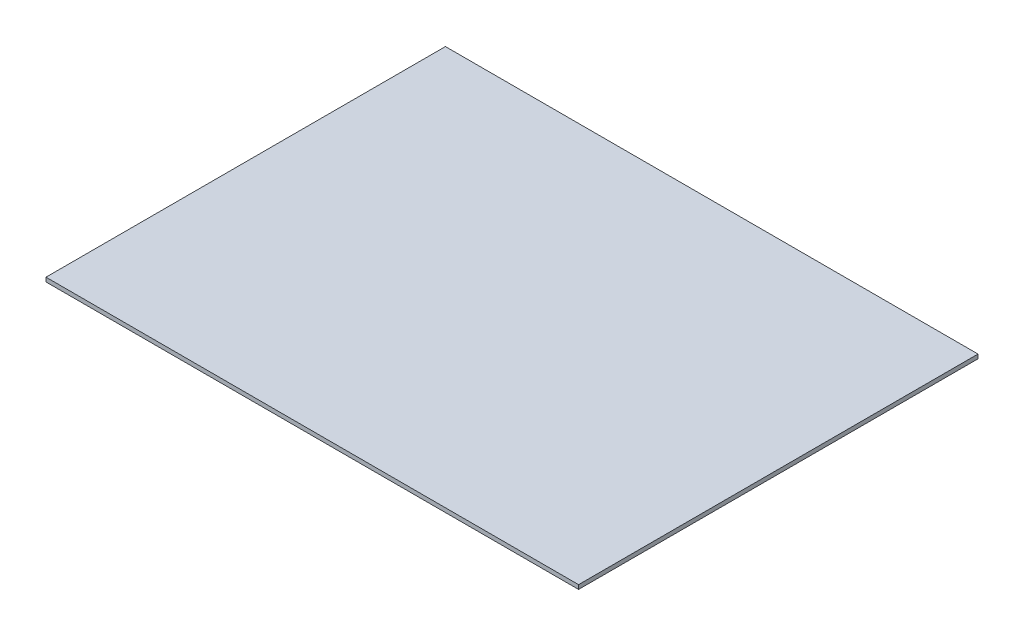
ISO-10303-21;
HEADER;
FILE_DESCRIPTION(('STEP AP214'),'2;1');
FILE_NAME('part.step','',(''),(''),'','','');
FILE_SCHEMA(('AUTOMOTIVE_DESIGN { 1 0 10303 214 1 1 1 1 }'));
ENDSEC;
DATA;
#1=APPLICATION_CONTEXT('core data for automotive mechanical design processes');
#2=APPLICATION_PROTOCOL_DEFINITION('international standard','automotive_design',2000,#1);
#3=PRODUCT_CONTEXT('',#1,'mechanical');
#4=PRODUCT('Part','Part','',(#3));
#5=PRODUCT_RELATED_PRODUCT_CATEGORY('part','',(#4));
#6=PRODUCT_DEFINITION_FORMATION('','',#4);
#7=PRODUCT_DEFINITION_CONTEXT('part definition',#1,'design');
#8=PRODUCT_DEFINITION('design','',#6,#7);
#9=PRODUCT_DEFINITION_SHAPE('','',#8);
#10=(LENGTH_UNIT() NAMED_UNIT(*) SI_UNIT(.MILLI.,.METRE.));
#11=(NAMED_UNIT(*) PLANE_ANGLE_UNIT() SI_UNIT($,.RADIAN.));
#12=(NAMED_UNIT(*) SI_UNIT($,.STERADIAN.) SOLID_ANGLE_UNIT());
#13=UNCERTAINTY_MEASURE_WITH_UNIT(LENGTH_MEASURE(1.E-05),#10,'distance_accuracy_value','');
#14=(GEOMETRIC_REPRESENTATION_CONTEXT(3) GLOBAL_UNCERTAINTY_ASSIGNED_CONTEXT((#13)) GLOBAL_UNIT_ASSIGNED_CONTEXT((#10,
#11,#12)) REPRESENTATION_CONTEXT('',''));
#15=CARTESIAN_POINT('',(0.,0.,0.));
#16=DIRECTION('',(0.,0.,1.));
#17=DIRECTION('',(1.,0.,0.));
#18=AXIS2_PLACEMENT_3D('',#15,#16,#17);
#19=CARTESIAN_POINT('',(203.2,3.175,0.));
#20=DIRECTION('',(-1.,0.,0.));
#21=DIRECTION('',(0.,0.,1.));
#22=AXIS2_PLACEMENT_3D('',#19,#20,#21);
#23=PLANE('',#22);
#24=DIRECTION('',(0.,0.,-1.));
#25=VECTOR('',#24,1.);
#26=CARTESIAN_POINT('',(203.2,0.,0.));
#27=LINE('',#26,#25);
#28=CARTESIAN_POINT('',(203.2,0.,0.));
#29=VERTEX_POINT('',#28);
#30=CARTESIAN_POINT('',(203.2,0.,-304.8));
#31=VERTEX_POINT('',#30);
#32=EDGE_CURVE('E96',#29,#31,#27,.T.);
#33=ORIENTED_EDGE('',*,*,#32,.T.);
#34=DIRECTION('',(0.,-1.,0.));
#35=VECTOR('',#34,1.);
#36=CARTESIAN_POINT('',(203.2,3.175,-304.8));
#37=LINE('',#36,#35);
#38=CARTESIAN_POINT('',(203.2,3.175,-304.8));
#39=VERTEX_POINT('',#38);
#40=EDGE_CURVE('E11',#39,#31,#37,.T.);
#41=ORIENTED_EDGE('',*,*,#40,.F.);
#42=DIRECTION('',(0.,0.,-1.));
#43=VECTOR('',#42,1.);
#44=CARTESIAN_POINT('',(203.2,3.175,0.));
#45=LINE('',#44,#43);
#46=CARTESIAN_POINT('',(203.2,3.175,0.));
#47=VERTEX_POINT('',#46);
#48=EDGE_CURVE('E84',#47,#39,#45,.T.);
#49=ORIENTED_EDGE('',*,*,#48,.F.);
#50=DIRECTION('',(0.,-1.,0.));
#51=VECTOR('',#50,1.);
#52=CARTESIAN_POINT('',(203.2,3.175,0.));
#53=LINE('',#52,#51);
#54=EDGE_CURVE('E92',#47,#29,#53,.T.);
#55=ORIENTED_EDGE('',*,*,#54,.T.);
#56=EDGE_LOOP('',(#33,#41,#49,#55));
#57=FACE_BOUND('',#56,.T.);
#58=ADVANCED_FACE('F33',(#57),#23,.F.);
#59=CARTESIAN_POINT('',(-203.2,3.175,-304.8));
#60=DIRECTION('',(0.,0.,1.));
#61=DIRECTION('',(1.,0.,0.));
#62=AXIS2_PLACEMENT_3D('',#59,#60,#61);
#63=PLANE('',#62);
#64=DIRECTION('',(-1.,0.,0.));
#65=VECTOR('',#64,1.);
#66=CARTESIAN_POINT('',(-203.2,0.,-304.8));
#67=LINE('',#66,#65);
#68=CARTESIAN_POINT('',(-203.2,0.,-304.8));
#69=VERTEX_POINT('',#68);
#70=EDGE_CURVE('E88',#31,#69,#67,.T.);
#71=ORIENTED_EDGE('',*,*,#70,.T.);
#72=DIRECTION('',(0.,-1.,0.));
#73=VECTOR('',#72,1.);
#74=CARTESIAN_POINT('',(-203.2,3.175,-304.8));
#75=LINE('',#74,#73);
#76=CARTESIAN_POINT('',(-203.2,3.175,-304.8));
#77=VERTEX_POINT('',#76);
#78=EDGE_CURVE('E41',#77,#69,#75,.T.);
#79=ORIENTED_EDGE('',*,*,#78,.F.);
#80=DIRECTION('',(-1.,0.,0.));
#81=VECTOR('',#80,1.);
#82=CARTESIAN_POINT('',(-203.2,3.175,-304.8));
#83=LINE('',#82,#81);
#84=EDGE_CURVE('E79',#39,#77,#83,.T.);
#85=ORIENTED_EDGE('',*,*,#84,.F.);
#86=ORIENTED_EDGE('',*,*,#40,.T.);
#87=EDGE_LOOP('',(#71,#79,#85,#86));
#88=FACE_BOUND('',#87,.T.);
#89=ADVANCED_FACE('F87',(#88),#63,.F.);
#90=CARTESIAN_POINT('',(-203.2,3.175,-304.8));
#91=DIRECTION('',(1.,0.,0.));
#92=DIRECTION('',(0.,0.,-1.));
#93=AXIS2_PLACEMENT_3D('',#90,#91,#92);
#94=PLANE('',#93);
#95=DIRECTION('',(0.,0.,1.));
#96=VECTOR('',#95,1.);
#97=CARTESIAN_POINT('',(-203.2,0.,-304.8));
#98=LINE('',#97,#96);
#99=CARTESIAN_POINT('',(-203.2,0.,0.));
#100=VERTEX_POINT('',#99);
#101=EDGE_CURVE('E66',#69,#100,#98,.T.);
#102=ORIENTED_EDGE('',*,*,#101,.T.);
#103=DIRECTION('',(0.,-1.,0.));
#104=VECTOR('',#103,1.);
#105=CARTESIAN_POINT('',(-203.2,3.175,0.));
#106=LINE('',#105,#104);
#107=CARTESIAN_POINT('',(-203.2,3.175,0.));
#108=VERTEX_POINT('',#107);
#109=EDGE_CURVE('E89',#108,#100,#106,.T.);
#110=ORIENTED_EDGE('',*,*,#109,.F.);
#111=DIRECTION('',(0.,0.,1.));
#112=VECTOR('',#111,1.);
#113=CARTESIAN_POINT('',(-203.2,3.175,-304.8));
#114=LINE('',#113,#112);
#115=EDGE_CURVE('E82',#77,#108,#114,.T.);
#116=ORIENTED_EDGE('',*,*,#115,.F.);
#117=ORIENTED_EDGE('',*,*,#78,.T.);
#118=EDGE_LOOP('',(#102,#110,#116,#117));
#119=FACE_BOUND('',#118,.T.);
#120=ADVANCED_FACE('F90',(#119),#94,.F.);
#121=CARTESIAN_POINT('',(-203.2,3.175,0.));
#122=DIRECTION('',(0.,0.,-1.));
#123=DIRECTION('',(-1.,0.,0.));
#124=AXIS2_PLACEMENT_3D('',#121,#122,#123);
#125=PLANE('',#124);
#126=DIRECTION('',(1.,0.,0.));
#127=VECTOR('',#126,1.);
#128=CARTESIAN_POINT('',(-203.2,0.,0.));
#129=LINE('',#128,#127);
#130=EDGE_CURVE('E72',#100,#29,#129,.T.);
#131=ORIENTED_EDGE('',*,*,#130,.T.);
#132=ORIENTED_EDGE('',*,*,#54,.F.);
#133=DIRECTION('',(1.,0.,0.));
#134=VECTOR('',#133,1.);
#135=CARTESIAN_POINT('',(-203.2,3.175,0.));
#136=LINE('',#135,#134);
#137=EDGE_CURVE('E49',#108,#47,#136,.T.);
#138=ORIENTED_EDGE('',*,*,#137,.F.);
#139=ORIENTED_EDGE('',*,*,#109,.T.);
#140=EDGE_LOOP('',(#131,#132,#138,#139));
#141=FACE_BOUND('',#140,.T.);
#142=ADVANCED_FACE('F103',(#141),#125,.F.);
#143=CARTESIAN_POINT('',(0.,3.175,0.));
#144=DIRECTION('',(0.,-1.,0.));
#145=DIRECTION('',(0.,0.,-1.));
#146=AXIS2_PLACEMENT_3D('',#143,#144,#145);
#147=PLANE('',#146);
#148=ORIENTED_EDGE('',*,*,#48,.T.);
#149=ORIENTED_EDGE('',*,*,#84,.T.);
#150=ORIENTED_EDGE('',*,*,#115,.T.);
#151=ORIENTED_EDGE('',*,*,#137,.T.);
#152=EDGE_LOOP('',(#148,#149,#150,#151));
#153=FACE_BOUND('',#152,.T.);
#154=ADVANCED_FACE('F80',(#153),#147,.F.);
#155=CARTESIAN_POINT('',(0.,0.,0.));
#156=DIRECTION('',(0.,-1.,0.));
#157=DIRECTION('',(0.,0.,-1.));
#158=AXIS2_PLACEMENT_3D('',#155,#156,#157);
#159=PLANE('',#158);
#160=ORIENTED_EDGE('',*,*,#32,.F.);
#161=ORIENTED_EDGE('',*,*,#130,.F.);
#162=ORIENTED_EDGE('',*,*,#101,.F.);
#163=ORIENTED_EDGE('',*,*,#70,.F.);
#164=EDGE_LOOP('',(#160,#161,#162,#163));
#165=FACE_BOUND('',#164,.T.);
#166=ADVANCED_FACE('F106',(#165),#159,.T.);
#167=CLOSED_SHELL('',(#58,#89,#120,#142,#154,#166));
#168=MANIFOLD_SOLID_BREP('B2',#167);
#169=ADVANCED_BREP_SHAPE_REPRESENTATION('',(#18,#168),#14);
#170=SHAPE_DEFINITION_REPRESENTATION(#9,#169);
ENDSEC;
END-ISO-10303-21;
